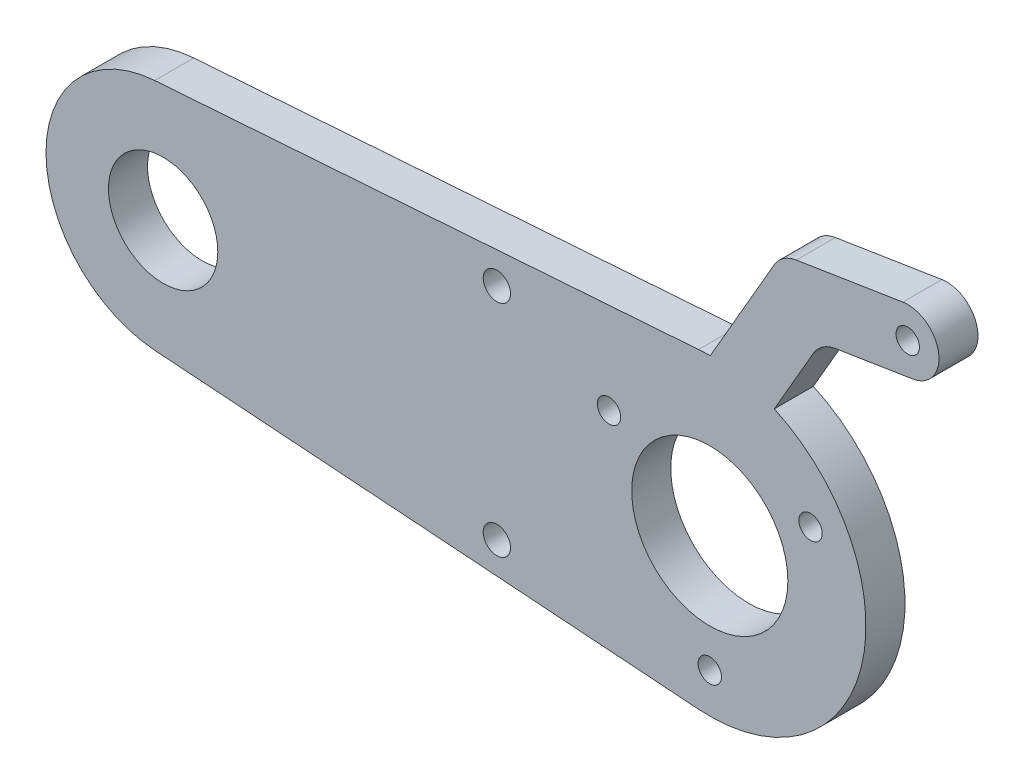
ISO-10303-21;
HEADER;
FILE_DESCRIPTION(('STEP AP214'),'2;1');
FILE_NAME('part.step','',(''),(''),'','','');
FILE_SCHEMA(('AUTOMOTIVE_DESIGN { 1 0 10303 214 1 1 1 1 }'));
ENDSEC;
DATA;
#1=APPLICATION_CONTEXT('core data for automotive mechanical design processes');
#2=APPLICATION_PROTOCOL_DEFINITION('international standard','automotive_design',2000,#1);
#3=PRODUCT_CONTEXT('',#1,'mechanical');
#4=PRODUCT('Part','Part','',(#3));
#5=PRODUCT_RELATED_PRODUCT_CATEGORY('part','',(#4));
#6=PRODUCT_DEFINITION_FORMATION('','',#4);
#7=PRODUCT_DEFINITION_CONTEXT('part definition',#1,'design');
#8=PRODUCT_DEFINITION('design','',#6,#7);
#9=PRODUCT_DEFINITION_SHAPE('','',#8);
#10=(LENGTH_UNIT() NAMED_UNIT(*) SI_UNIT(.MILLI.,.METRE.));
#11=(NAMED_UNIT(*) PLANE_ANGLE_UNIT() SI_UNIT($,.RADIAN.));
#12=(NAMED_UNIT(*) SI_UNIT($,.STERADIAN.) SOLID_ANGLE_UNIT());
#13=UNCERTAINTY_MEASURE_WITH_UNIT(LENGTH_MEASURE(1.E-05),#10,'distance_accuracy_value','');
#14=(GEOMETRIC_REPRESENTATION_CONTEXT(3) GLOBAL_UNCERTAINTY_ASSIGNED_CONTEXT((#13)) GLOBAL_UNIT_ASSIGNED_CONTEXT((#10,
#11,#12)) REPRESENTATION_CONTEXT('',''));
#15=CARTESIAN_POINT('',(0.,0.,0.));
#16=DIRECTION('',(0.,0.,1.));
#17=DIRECTION('',(1.,0.,0.));
#18=AXIS2_PLACEMENT_3D('',#15,#16,#17);
#19=CARTESIAN_POINT('',(0.,0.,5.));
#20=DIRECTION('',(0.,0.,-1.));
#21=DIRECTION('',(-1.,0.,0.));
#22=AXIS2_PLACEMENT_3D('',#19,#20,#21);
#23=PLANE('',#22);
#24=CARTESIAN_POINT('',(0.,0.,5.));
#25=DIRECTION('',(0.,0.,1.));
#26=DIRECTION('',(-1.,0.,0.));
#27=AXIS2_PLACEMENT_3D('',#24,#25,#26);
#28=CIRCLE('',#27,20.);
#29=CARTESIAN_POINT('',(-1.42857142857143,-19.9489143482413,5.));
#30=VERTEX_POINT('',#29);
#31=CARTESIAN_POINT('',(8.26328421639514,18.2131308115622,5.));
#32=VERTEX_POINT('',#31);
#33=EDGE_CURVE('E178',#30,#32,#28,.T.);
#34=ORIENTED_EDGE('',*,*,#33,.T.);
#35=DIRECTION('',(0.499999999999994,0.866025403784442,0.));
#36=VECTOR('',#35,1.);
#37=CARTESIAN_POINT('',(13.2632842163951,26.8733848494066,5.));
#38=LINE('',#37,#36);
#39=CARTESIAN_POINT('',(13.2632842163951,26.8733848494066,5.));
#40=VERTEX_POINT('',#39);
#41=EDGE_CURVE('E106',#32,#40,#38,.T.);
#42=ORIENTED_EDGE('',*,*,#41,.T.);
#43=CARTESIAN_POINT('',(16.7273858315328,24.8733848494066,5.));
#44=DIRECTION('',(0.,0.,-1.));
#45=DIRECTION('',(1.,0.,0.));
#46=AXIS2_PLACEMENT_3D('',#43,#44,#45);
#47=CIRCLE('',#46,4.);
#48=CARTESIAN_POINT('',(16.1016479713719,28.8241382117871,5.));
#49=VERTEX_POINT('',#48);
#50=EDGE_CURVE('E205',#40,#49,#47,.T.);
#51=ORIENTED_EDGE('',*,*,#50,.T.);
#52=DIRECTION('',(0.987688340595136,0.156434465040243,0.));
#53=VECTOR('',#52,1.);
#54=CARTESIAN_POINT('',(25.9785313773232,30.3884828621896,5.));
#55=LINE('',#54,#53);
#56=CARTESIAN_POINT('',(25.9785313773232,30.3884828621896,5.));
#57=VERTEX_POINT('',#56);
#58=EDGE_CURVE('E224',#49,#57,#55,.T.);
#59=ORIENTED_EDGE('',*,*,#58,.T.);
#60=CARTESIAN_POINT('',(25.3527935171623,34.3392362245701,5.));
#61=DIRECTION('',(0.,0.,1.));
#62=DIRECTION('',(1.,0.,0.));
#63=AXIS2_PLACEMENT_3D('',#60,#61,#62);
#64=CIRCLE('',#63,4.);
#65=CARTESIAN_POINT('',(24.7270556570013,38.2899895869507,5.));
#66=VERTEX_POINT('',#65);
#67=EDGE_CURVE('E221',#57,#66,#64,.T.);
#68=ORIENTED_EDGE('',*,*,#67,.T.);
#69=DIRECTION('',(-0.987688340595136,-0.156434465040243,0.));
#70=VECTOR('',#69,1.);
#71=CARTESIAN_POINT('',(11.0813468718889,36.1287216381888,5.));
#72=LINE('',#71,#70);
#73=CARTESIAN_POINT('',(11.0813468718889,36.1287216381888,5.));
#74=VERTEX_POINT('',#73);
#75=EDGE_CURVE('E223',#66,#74,#72,.T.);
#76=ORIENTED_EDGE('',*,*,#75,.T.);
#77=CARTESIAN_POINT('',(11.7070847320499,32.1779682758083,5.));
#78=DIRECTION('',(0.,0.,1.));
#79=DIRECTION('',(-1.,0.,0.));
#80=AXIS2_PLACEMENT_3D('',#77,#78,#79);
#81=CIRCLE('',#80,3.99999999999999);
#82=CARTESIAN_POINT('',(8.24298311691214,34.1779682758083,5.));
#83=VERTEX_POINT('',#82);
#84=EDGE_CURVE('E226',#74,#83,#81,.T.);
#85=ORIENTED_EDGE('',*,*,#84,.T.);
#86=DIRECTION('',(-0.499999999999994,-0.866025403784442,0.));
#87=VECTOR('',#86,1.);
#88=CARTESIAN_POINT('',(8.24298311691214,34.1779682758083,5.));
#89=LINE('',#88,#87);
#90=CARTESIAN_POINT('',(0.0572819558484016,19.9999179692701,5.));
#91=VERTEX_POINT('',#90);
#92=EDGE_CURVE('E232',#83,#91,#89,.T.);
#93=ORIENTED_EDGE('',*,*,#92,.T.);
#94=CARTESIAN_POINT('',(0.,0.,5.));
#95=DIRECTION('',(0.,0.,1.));
#96=DIRECTION('',(1.,0.,0.));
#97=AXIS2_PLACEMENT_3D('',#94,#95,#96);
#98=CIRCLE('',#97,20.);
#99=CARTESIAN_POINT('',(-1.42857142857143,19.9489143482413,5.));
#100=VERTEX_POINT('',#99);
#101=EDGE_CURVE('E137',#91,#100,#98,.T.);
#102=ORIENTED_EDGE('',*,*,#101,.T.);
#103=DIRECTION('',(-0.997445717412067,-0.0714285714285714,0.));
#104=VECTOR('',#103,1.);
#105=CARTESIAN_POINT('',(-71.0714285714286,14.961685761181,5.));
#106=LINE('',#105,#104);
#107=CARTESIAN_POINT('',(-71.0714285714286,14.961685761181,5.));
#108=VERTEX_POINT('',#107);
#109=EDGE_CURVE('E131',#100,#108,#106,.T.);
#110=ORIENTED_EDGE('',*,*,#109,.T.);
#111=CARTESIAN_POINT('',(-70.,0.,5.));
#112=DIRECTION('',(0.,0.,1.));
#113=DIRECTION('',(-1.,0.,0.));
#114=AXIS2_PLACEMENT_3D('',#111,#112,#113);
#115=CIRCLE('',#114,15.);
#116=CARTESIAN_POINT('',(-71.0714285714286,-14.961685761181,5.));
#117=VERTEX_POINT('',#116);
#118=EDGE_CURVE('E135',#108,#117,#115,.T.);
#119=ORIENTED_EDGE('',*,*,#118,.T.);
#120=DIRECTION('',(0.997445717412067,-0.0714285714285714,0.));
#121=VECTOR('',#120,1.);
#122=CARTESIAN_POINT('',(-71.0714285714286,-14.961685761181,5.));
#123=LINE('',#122,#121);
#124=EDGE_CURVE('E51',#117,#30,#123,.T.);
#125=ORIENTED_EDGE('',*,*,#124,.T.);
#126=EDGE_LOOP('',(#34,#42,#51,#59,#68,#76,#85,#93,#102,#110,#119,#125));
#127=FACE_BOUND('',#126,.T.);
#128=CARTESIAN_POINT('',(0.,0.,5.));
#129=DIRECTION('',(0.,0.,1.));
#130=DIRECTION('',(1.,0.,0.));
#131=AXIS2_PLACEMENT_3D('',#128,#129,#130);
#132=CIRCLE('',#131,10.);
#133=CARTESIAN_POINT('',(10.,0.,5.));
#134=VERTEX_POINT('',#133);
#135=EDGE_CURVE('E159',#134,#134,#132,.T.);
#136=ORIENTED_EDGE('',*,*,#135,.F.);
#137=EDGE_LOOP('',(#136));
#138=FACE_BOUND('',#137,.T.);
#139=CARTESIAN_POINT('',(-70.,0.,5.));
#140=DIRECTION('',(0.,0.,1.));
#141=DIRECTION('',(1.,0.,0.));
#142=AXIS2_PLACEMENT_3D('',#139,#140,#141);
#143=CIRCLE('',#142,7.);
#144=CARTESIAN_POINT('',(-63.,0.,5.));
#145=VERTEX_POINT('',#144);
#146=EDGE_CURVE('E336',#145,#145,#143,.T.);
#147=ORIENTED_EDGE('',*,*,#146,.F.);
#148=EDGE_LOOP('',(#147));
#149=FACE_BOUND('',#148,.T.);
#150=CARTESIAN_POINT('',(-12.9037785163881,7.45,5.));
#151=DIRECTION('',(0.,0.,1.));
#152=DIRECTION('',(1.,0.,0.));
#153=AXIS2_PLACEMENT_3D('',#150,#151,#152);
#154=CIRCLE('',#153,1.5);
#155=CARTESIAN_POINT('',(-11.4037785163881,7.45,5.));
#156=VERTEX_POINT('',#155);
#157=EDGE_CURVE('E330',#156,#156,#154,.T.);
#158=ORIENTED_EDGE('',*,*,#157,.F.);
#159=EDGE_LOOP('',(#158));
#160=FACE_BOUND('',#159,.T.);
#161=CARTESIAN_POINT('',(0.,-14.9000000000001,5.));
#162=DIRECTION('',(0.,0.,1.));
#163=DIRECTION('',(1.,0.,0.));
#164=AXIS2_PLACEMENT_3D('',#161,#162,#163);
#165=CIRCLE('',#164,1.5);
#166=CARTESIAN_POINT('',(1.5,-14.9000000000001,5.));
#167=VERTEX_POINT('',#166);
#168=EDGE_CURVE('E324',#167,#167,#165,.T.);
#169=ORIENTED_EDGE('',*,*,#168,.F.);
#170=EDGE_LOOP('',(#169));
#171=FACE_BOUND('',#170,.T.);
#172=CARTESIAN_POINT('',(12.9037785163882,7.44999999999981,5.));
#173=DIRECTION('',(0.,0.,1.));
#174=DIRECTION('',(1.,0.,0.));
#175=AXIS2_PLACEMENT_3D('',#172,#173,#174);
#176=CIRCLE('',#175,1.5);
#177=CARTESIAN_POINT('',(14.4037785163882,7.44999999999981,5.));
#178=VERTEX_POINT('',#177);
#179=EDGE_CURVE('E318',#178,#178,#176,.T.);
#180=ORIENTED_EDGE('',*,*,#179,.F.);
#181=EDGE_LOOP('',(#180));
#182=FACE_BOUND('',#181,.T.);
#183=CARTESIAN_POINT('',(-27.2623215608162,14.0886777814287,5.));
#184=DIRECTION('',(0.,0.,1.));
#185=DIRECTION('',(1.,0.,0.));
#186=AXIS2_PLACEMENT_3D('',#183,#184,#185);
#187=CIRCLE('',#186,1.75);
#188=CARTESIAN_POINT('',(-25.5123215608162,14.0886777814287,5.));
#189=VERTEX_POINT('',#188);
#190=EDGE_CURVE('E312',#189,#189,#187,.T.);
#191=ORIENTED_EDGE('',*,*,#190,.F.);
#192=EDGE_LOOP('',(#191));
#193=FACE_BOUND('',#192,.T.);
#194=CARTESIAN_POINT('',(-27.2623215608162,-14.0886777814287,5.));
#195=DIRECTION('',(0.,0.,1.));
#196=DIRECTION('',(1.,0.,0.));
#197=AXIS2_PLACEMENT_3D('',#194,#195,#196);
#198=CIRCLE('',#197,1.75);
#199=CARTESIAN_POINT('',(-25.5123215608162,-14.0886777814287,5.));
#200=VERTEX_POINT('',#199);
#201=EDGE_CURVE('E306',#200,#200,#198,.T.);
#202=ORIENTED_EDGE('',*,*,#201,.F.);
#203=EDGE_LOOP('',(#202));
#204=FACE_BOUND('',#203,.T.);
#205=CARTESIAN_POINT('',(25.3527935171623,34.3392362245701,5.));
#206=DIRECTION('',(0.,0.,1.));
#207=DIRECTION('',(1.,0.,0.));
#208=AXIS2_PLACEMENT_3D('',#205,#206,#207);
#209=CIRCLE('',#208,1.5);
#210=CARTESIAN_POINT('',(26.8527935171623,34.3392362245701,5.));
#211=VERTEX_POINT('',#210);
#212=EDGE_CURVE('E297',#211,#211,#209,.T.);
#213=ORIENTED_EDGE('',*,*,#212,.F.);
#214=EDGE_LOOP('',(#213));
#215=FACE_BOUND('',#214,.T.);
#216=ADVANCED_FACE('F34',(#127,#138,#149,#160,#171,#182,#193,#204,#215),#23,.F.);
#217=CARTESIAN_POINT('',(0.,0.,0.));
#218=DIRECTION('',(0.,0.,-1.));
#219=DIRECTION('',(-1.,0.,0.));
#220=AXIS2_PLACEMENT_3D('',#217,#218,#219);
#221=PLANE('',#220);
#222=CARTESIAN_POINT('',(-27.2623215608162,-14.0886777814287,0.));
#223=DIRECTION('',(0.,0.,1.));
#224=DIRECTION('',(1.,0.,0.));
#225=AXIS2_PLACEMENT_3D('',#222,#223,#224);
#226=CIRCLE('',#225,1.75);
#227=CARTESIAN_POINT('',(-25.5123215608162,-14.0886777814287,0.));
#228=VERTEX_POINT('',#227);
#229=EDGE_CURVE('E303',#228,#228,#226,.T.);
#230=ORIENTED_EDGE('',*,*,#229,.T.);
#231=EDGE_LOOP('',(#230));
#232=FACE_BOUND('',#231,.T.);
#233=CARTESIAN_POINT('',(12.9037785163882,7.44999999999981,0.));
#234=DIRECTION('',(0.,0.,1.));
#235=DIRECTION('',(1.,0.,0.));
#236=AXIS2_PLACEMENT_3D('',#233,#234,#235);
#237=CIRCLE('',#236,1.5);
#238=CARTESIAN_POINT('',(14.4037785163882,7.44999999999981,0.));
#239=VERTEX_POINT('',#238);
#240=EDGE_CURVE('E315',#239,#239,#237,.T.);
#241=ORIENTED_EDGE('',*,*,#240,.T.);
#242=EDGE_LOOP('',(#241));
#243=FACE_BOUND('',#242,.T.);
#244=CARTESIAN_POINT('',(-12.9037785163881,7.45,0.));
#245=DIRECTION('',(0.,0.,1.));
#246=DIRECTION('',(1.,0.,0.));
#247=AXIS2_PLACEMENT_3D('',#244,#245,#246);
#248=CIRCLE('',#247,1.5);
#249=CARTESIAN_POINT('',(-11.4037785163881,7.45,0.));
#250=VERTEX_POINT('',#249);
#251=EDGE_CURVE('E327',#250,#250,#248,.T.);
#252=ORIENTED_EDGE('',*,*,#251,.T.);
#253=EDGE_LOOP('',(#252));
#254=FACE_BOUND('',#253,.T.);
#255=CARTESIAN_POINT('',(0.,0.,0.));
#256=DIRECTION('',(0.,0.,1.));
#257=DIRECTION('',(1.,0.,0.));
#258=AXIS2_PLACEMENT_3D('',#255,#256,#257);
#259=CIRCLE('',#258,10.);
#260=CARTESIAN_POINT('',(10.,0.,0.));
#261=VERTEX_POINT('',#260);
#262=EDGE_CURVE('E339',#261,#261,#259,.T.);
#263=ORIENTED_EDGE('',*,*,#262,.T.);
#264=EDGE_LOOP('',(#263));
#265=FACE_BOUND('',#264,.T.);
#266=CARTESIAN_POINT('',(0.,0.,0.));
#267=DIRECTION('',(0.,0.,1.));
#268=DIRECTION('',(-1.,0.,0.));
#269=AXIS2_PLACEMENT_3D('',#266,#267,#268);
#270=CIRCLE('',#269,20.);
#271=CARTESIAN_POINT('',(-1.42857142857143,-19.9489143482413,0.));
#272=VERTEX_POINT('',#271);
#273=CARTESIAN_POINT('',(8.26328421639514,18.2131308115622,0.));
#274=VERTEX_POINT('',#273);
#275=EDGE_CURVE('E155',#272,#274,#270,.T.);
#276=ORIENTED_EDGE('',*,*,#275,.F.);
#277=DIRECTION('',(0.997445717412067,-0.0714285714285714,0.));
#278=VECTOR('',#277,1.);
#279=CARTESIAN_POINT('',(-71.0714285714286,-14.961685761181,0.));
#280=LINE('',#279,#278);
#281=CARTESIAN_POINT('',(-71.0714285714286,-14.961685761181,0.));
#282=VERTEX_POINT('',#281);
#283=EDGE_CURVE('E98',#282,#272,#280,.T.);
#284=ORIENTED_EDGE('',*,*,#283,.F.);
#285=CARTESIAN_POINT('',(-70.,0.,0.));
#286=DIRECTION('',(0.,0.,1.));
#287=DIRECTION('',(-1.,0.,0.));
#288=AXIS2_PLACEMENT_3D('',#285,#286,#287);
#289=CIRCLE('',#288,15.);
#290=CARTESIAN_POINT('',(-71.0714285714286,14.961685761181,0.));
#291=VERTEX_POINT('',#290);
#292=EDGE_CURVE('E92',#291,#282,#289,.T.);
#293=ORIENTED_EDGE('',*,*,#292,.F.);
#294=DIRECTION('',(-0.997445717412067,-0.0714285714285714,0.));
#295=VECTOR('',#294,1.);
#296=CARTESIAN_POINT('',(-71.0714285714286,14.961685761181,0.));
#297=LINE('',#296,#295);
#298=CARTESIAN_POINT('',(-1.42857142857143,19.9489143482413,0.));
#299=VERTEX_POINT('',#298);
#300=EDGE_CURVE('E145',#299,#291,#297,.T.);
#301=ORIENTED_EDGE('',*,*,#300,.F.);
#302=CARTESIAN_POINT('',(0.,0.,0.));
#303=DIRECTION('',(0.,0.,1.));
#304=DIRECTION('',(1.,0.,0.));
#305=AXIS2_PLACEMENT_3D('',#302,#303,#304);
#306=CIRCLE('',#305,20.);
#307=CARTESIAN_POINT('',(0.0572819558484016,19.9999179692701,0.));
#308=VERTEX_POINT('',#307);
#309=EDGE_CURVE('E173',#308,#299,#306,.T.);
#310=ORIENTED_EDGE('',*,*,#309,.F.);
#311=DIRECTION('',(-0.499999999999994,-0.866025403784442,0.));
#312=VECTOR('',#311,1.);
#313=CARTESIAN_POINT('',(8.24298311691214,34.1779682758083,0.));
#314=LINE('',#313,#312);
#315=CARTESIAN_POINT('',(8.24298311691214,34.1779682758083,0.));
#316=VERTEX_POINT('',#315);
#317=EDGE_CURVE('E171',#316,#308,#314,.T.);
#318=ORIENTED_EDGE('',*,*,#317,.F.);
#319=CARTESIAN_POINT('',(11.7070847320499,32.1779682758083,0.));
#320=DIRECTION('',(0.,0.,1.));
#321=DIRECTION('',(-1.,0.,0.));
#322=AXIS2_PLACEMENT_3D('',#319,#320,#321);
#323=CIRCLE('',#322,3.99999999999999);
#324=CARTESIAN_POINT('',(11.0813468718889,36.1287216381888,0.));
#325=VERTEX_POINT('',#324);
#326=EDGE_CURVE('E169',#325,#316,#323,.T.);
#327=ORIENTED_EDGE('',*,*,#326,.F.);
#328=DIRECTION('',(-0.987688340595136,-0.156434465040243,0.));
#329=VECTOR('',#328,1.);
#330=CARTESIAN_POINT('',(11.0813468718889,36.1287216381888,0.));
#331=LINE('',#330,#329);
#332=CARTESIAN_POINT('',(24.7270556570013,38.2899895869507,0.));
#333=VERTEX_POINT('',#332);
#334=EDGE_CURVE('E167',#333,#325,#331,.T.);
#335=ORIENTED_EDGE('',*,*,#334,.F.);
#336=CARTESIAN_POINT('',(25.3527935171623,34.3392362245701,0.));
#337=DIRECTION('',(0.,0.,1.));
#338=DIRECTION('',(1.,0.,0.));
#339=AXIS2_PLACEMENT_3D('',#336,#337,#338);
#340=CIRCLE('',#339,4.);
#341=CARTESIAN_POINT('',(25.9785313773232,30.3884828621896,0.));
#342=VERTEX_POINT('',#341);
#343=EDGE_CURVE('E165',#342,#333,#340,.T.);
#344=ORIENTED_EDGE('',*,*,#343,.F.);
#345=DIRECTION('',(0.987688340595136,0.156434465040243,0.));
#346=VECTOR('',#345,1.);
#347=CARTESIAN_POINT('',(25.9785313773232,30.3884828621896,0.));
#348=LINE('',#347,#346);
#349=CARTESIAN_POINT('',(16.1016479713719,28.8241382117871,0.));
#350=VERTEX_POINT('',#349);
#351=EDGE_CURVE('E163',#350,#342,#348,.T.);
#352=ORIENTED_EDGE('',*,*,#351,.F.);
#353=CARTESIAN_POINT('',(16.7273858315328,24.8733848494066,0.));
#354=DIRECTION('',(0.,0.,-1.));
#355=DIRECTION('',(1.,0.,0.));
#356=AXIS2_PLACEMENT_3D('',#353,#354,#355);
#357=CIRCLE('',#356,4.);
#358=CARTESIAN_POINT('',(13.2632842163951,26.8733848494066,0.));
#359=VERTEX_POINT('',#358);
#360=EDGE_CURVE('E161',#359,#350,#357,.T.);
#361=ORIENTED_EDGE('',*,*,#360,.F.);
#362=DIRECTION('',(0.499999999999994,0.866025403784442,0.));
#363=VECTOR('',#362,1.);
#364=CARTESIAN_POINT('',(13.2632842163951,26.8733848494066,0.));
#365=LINE('',#364,#363);
#366=EDGE_CURVE('E158',#274,#359,#365,.T.);
#367=ORIENTED_EDGE('',*,*,#366,.F.);
#368=EDGE_LOOP('',(#276,#284,#293,#301,#310,#318,#327,#335,#344,#352,#361,#367));
#369=FACE_BOUND('',#368,.T.);
#370=CARTESIAN_POINT('',(-70.,0.,0.));
#371=DIRECTION('',(0.,0.,1.));
#372=DIRECTION('',(1.,0.,0.));
#373=AXIS2_PLACEMENT_3D('',#370,#371,#372);
#374=CIRCLE('',#373,7.);
#375=CARTESIAN_POINT('',(-63.,0.,0.));
#376=VERTEX_POINT('',#375);
#377=EDGE_CURVE('E333',#376,#376,#374,.T.);
#378=ORIENTED_EDGE('',*,*,#377,.T.);
#379=EDGE_LOOP('',(#378));
#380=FACE_BOUND('',#379,.T.);
#381=CARTESIAN_POINT('',(0.,-14.9000000000001,0.));
#382=DIRECTION('',(0.,0.,1.));
#383=DIRECTION('',(1.,0.,0.));
#384=AXIS2_PLACEMENT_3D('',#381,#382,#383);
#385=CIRCLE('',#384,1.5);
#386=CARTESIAN_POINT('',(1.5,-14.9000000000001,0.));
#387=VERTEX_POINT('',#386);
#388=EDGE_CURVE('E321',#387,#387,#385,.T.);
#389=ORIENTED_EDGE('',*,*,#388,.T.);
#390=EDGE_LOOP('',(#389));
#391=FACE_BOUND('',#390,.T.);
#392=CARTESIAN_POINT('',(-27.2623215608162,14.0886777814287,0.));
#393=DIRECTION('',(0.,0.,1.));
#394=DIRECTION('',(1.,0.,0.));
#395=AXIS2_PLACEMENT_3D('',#392,#393,#394);
#396=CIRCLE('',#395,1.75);
#397=CARTESIAN_POINT('',(-25.5123215608162,14.0886777814287,0.));
#398=VERTEX_POINT('',#397);
#399=EDGE_CURVE('E309',#398,#398,#396,.T.);
#400=ORIENTED_EDGE('',*,*,#399,.T.);
#401=EDGE_LOOP('',(#400));
#402=FACE_BOUND('',#401,.T.);
#403=CARTESIAN_POINT('',(25.3527935171623,34.3392362245701,0.));
#404=DIRECTION('',(0.,0.,1.));
#405=DIRECTION('',(1.,0.,0.));
#406=AXIS2_PLACEMENT_3D('',#403,#404,#405);
#407=CIRCLE('',#406,1.5);
#408=CARTESIAN_POINT('',(26.8527935171623,34.3392362245701,0.));
#409=VERTEX_POINT('',#408);
#410=EDGE_CURVE('E300',#409,#409,#407,.T.);
#411=ORIENTED_EDGE('',*,*,#410,.T.);
#412=EDGE_LOOP('',(#411));
#413=FACE_BOUND('',#412,.T.);
#414=ADVANCED_FACE('F209',(#232,#243,#254,#265,#369,#380,#391,#402,#413),#221,.T.);
#415=CARTESIAN_POINT('',(0.,0.,5.));
#416=DIRECTION('',(0.,0.,-1.));
#417=DIRECTION('',(-1.,0.,0.));
#418=AXIS2_PLACEMENT_3D('',#415,#416,#417);
#419=CYLINDRICAL_SURFACE('',#418,20.);
#420=ORIENTED_EDGE('',*,*,#275,.T.);
#421=DIRECTION('',(0.,0.,-1.));
#422=VECTOR('',#421,1.);
#423=CARTESIAN_POINT('',(8.26328421639514,18.2131308115622,5.));
#424=LINE('',#423,#422);
#425=EDGE_CURVE('E11',#32,#274,#424,.T.);
#426=ORIENTED_EDGE('',*,*,#425,.F.);
#427=ORIENTED_EDGE('',*,*,#33,.F.);
#428=DIRECTION('',(0.,0.,-1.));
#429=VECTOR('',#428,1.);
#430=CARTESIAN_POINT('',(-1.42857142857143,-19.9489143482413,5.));
#431=LINE('',#430,#429);
#432=EDGE_CURVE('E151',#30,#272,#431,.T.);
#433=ORIENTED_EDGE('',*,*,#432,.T.);
#434=EDGE_LOOP('',(#420,#426,#427,#433));
#435=FACE_BOUND('',#434,.T.);
#436=ADVANCED_FACE('F36',(#435),#419,.T.);
#437=CARTESIAN_POINT('',(13.2632842163951,26.8733848494066,5.));
#438=DIRECTION('',(-0.866025403784442,0.499999999999994,0.));
#439=DIRECTION('',(-0.499999999999994,-0.866025403784442,0.));
#440=AXIS2_PLACEMENT_3D('',#437,#438,#439);
#441=PLANE('',#440);
#442=ORIENTED_EDGE('',*,*,#366,.T.);
#443=DIRECTION('',(0.,0.,-1.));
#444=VECTOR('',#443,1.);
#445=CARTESIAN_POINT('',(13.2632842163951,26.8733848494066,5.));
#446=LINE('',#445,#444);
#447=EDGE_CURVE('E43',#40,#359,#446,.T.);
#448=ORIENTED_EDGE('',*,*,#447,.F.);
#449=ORIENTED_EDGE('',*,*,#41,.F.);
#450=ORIENTED_EDGE('',*,*,#425,.T.);
#451=EDGE_LOOP('',(#442,#448,#449,#450));
#452=FACE_BOUND('',#451,.T.);
#453=ADVANCED_FACE('F487',(#452),#441,.F.);
#454=CARTESIAN_POINT('',(16.7273858315328,24.8733848494066,5.));
#455=DIRECTION('',(0.,0.,-1.));
#456=DIRECTION('',(-1.,0.,0.));
#457=AXIS2_PLACEMENT_3D('',#454,#455,#456);
#458=CYLINDRICAL_SURFACE('',#457,4.);
#459=ORIENTED_EDGE('',*,*,#360,.T.);
#460=DIRECTION('',(0.,0.,-1.));
#461=VECTOR('',#460,1.);
#462=CARTESIAN_POINT('',(16.1016479713719,28.8241382117871,5.));
#463=LINE('',#462,#461);
#464=EDGE_CURVE('E197',#49,#350,#463,.T.);
#465=ORIENTED_EDGE('',*,*,#464,.F.);
#466=ORIENTED_EDGE('',*,*,#50,.F.);
#467=ORIENTED_EDGE('',*,*,#447,.T.);
#468=EDGE_LOOP('',(#459,#465,#466,#467));
#469=FACE_BOUND('',#468,.T.);
#470=ADVANCED_FACE('F203',(#469),#458,.F.);
#471=CARTESIAN_POINT('',(25.9785313773232,30.3884828621896,5.));
#472=DIRECTION('',(-0.156434465040243,0.987688340595136,0.));
#473=DIRECTION('',(-0.987688340595136,-0.156434465040243,0.));
#474=AXIS2_PLACEMENT_3D('',#471,#472,#473);
#475=PLANE('',#474);
#476=ORIENTED_EDGE('',*,*,#351,.T.);
#477=DIRECTION('',(0.,0.,-1.));
#478=VECTOR('',#477,1.);
#479=CARTESIAN_POINT('',(25.9785313773232,30.3884828621896,5.));
#480=LINE('',#479,#478);
#481=EDGE_CURVE('E194',#57,#342,#480,.T.);
#482=ORIENTED_EDGE('',*,*,#481,.F.);
#483=ORIENTED_EDGE('',*,*,#58,.F.);
#484=ORIENTED_EDGE('',*,*,#464,.T.);
#485=EDGE_LOOP('',(#476,#482,#483,#484));
#486=FACE_BOUND('',#485,.T.);
#487=ADVANCED_FACE('F215',(#486),#475,.F.);
#488=CARTESIAN_POINT('',(25.3527935171623,34.3392362245701,5.));
#489=DIRECTION('',(0.,0.,-1.));
#490=DIRECTION('',(-1.,0.,0.));
#491=AXIS2_PLACEMENT_3D('',#488,#489,#490);
#492=CYLINDRICAL_SURFACE('',#491,4.);
#493=ORIENTED_EDGE('',*,*,#343,.T.);
#494=DIRECTION('',(0.,0.,-1.));
#495=VECTOR('',#494,1.);
#496=CARTESIAN_POINT('',(24.7270556570013,38.2899895869507,5.));
#497=LINE('',#496,#495);
#498=EDGE_CURVE('E191',#66,#333,#497,.T.);
#499=ORIENTED_EDGE('',*,*,#498,.F.);
#500=ORIENTED_EDGE('',*,*,#67,.F.);
#501=ORIENTED_EDGE('',*,*,#481,.T.);
#502=EDGE_LOOP('',(#493,#499,#500,#501));
#503=FACE_BOUND('',#502,.T.);
#504=ADVANCED_FACE('F219',(#503),#492,.T.);
#505=CARTESIAN_POINT('',(11.0813468718889,36.1287216381888,5.));
#506=DIRECTION('',(0.156434465040243,-0.987688340595136,0.));
#507=DIRECTION('',(0.987688340595136,0.156434465040243,0.));
#508=AXIS2_PLACEMENT_3D('',#505,#506,#507);
#509=PLANE('',#508);
#510=ORIENTED_EDGE('',*,*,#334,.T.);
#511=DIRECTION('',(0.,0.,-1.));
#512=VECTOR('',#511,1.);
#513=CARTESIAN_POINT('',(11.0813468718889,36.1287216381888,5.));
#514=LINE('',#513,#512);
#515=EDGE_CURVE('E188',#74,#325,#514,.T.);
#516=ORIENTED_EDGE('',*,*,#515,.F.);
#517=ORIENTED_EDGE('',*,*,#75,.F.);
#518=ORIENTED_EDGE('',*,*,#498,.T.);
#519=EDGE_LOOP('',(#510,#516,#517,#518));
#520=FACE_BOUND('',#519,.T.);
#521=ADVANCED_FACE('F452',(#520),#509,.F.);
#522=CARTESIAN_POINT('',(11.7070847320499,32.1779682758083,5.));
#523=DIRECTION('',(0.,0.,-1.));
#524=DIRECTION('',(-1.,0.,0.));
#525=AXIS2_PLACEMENT_3D('',#522,#523,#524);
#526=CYLINDRICAL_SURFACE('',#525,3.99999999999999);
#527=ORIENTED_EDGE('',*,*,#326,.T.);
#528=DIRECTION('',(0.,0.,-1.));
#529=VECTOR('',#528,1.);
#530=CARTESIAN_POINT('',(8.24298311691214,34.1779682758083,5.));
#531=LINE('',#530,#529);
#532=EDGE_CURVE('E185',#83,#316,#531,.T.);
#533=ORIENTED_EDGE('',*,*,#532,.F.);
#534=ORIENTED_EDGE('',*,*,#84,.F.);
#535=ORIENTED_EDGE('',*,*,#515,.T.);
#536=EDGE_LOOP('',(#527,#533,#534,#535));
#537=FACE_BOUND('',#536,.T.);
#538=ADVANCED_FACE('F443',(#537),#526,.T.);
#539=CARTESIAN_POINT('',(8.24298311691214,34.1779682758083,5.));
#540=DIRECTION('',(0.866025403784442,-0.499999999999994,0.));
#541=DIRECTION('',(0.499999999999994,0.866025403784442,0.));
#542=AXIS2_PLACEMENT_3D('',#539,#540,#541);
#543=PLANE('',#542);
#544=ORIENTED_EDGE('',*,*,#317,.T.);
#545=DIRECTION('',(0.,0.,-1.));
#546=VECTOR('',#545,1.);
#547=CARTESIAN_POINT('',(0.0572819558484016,19.9999179692701,5.));
#548=LINE('',#547,#546);
#549=EDGE_CURVE('E182',#91,#308,#548,.T.);
#550=ORIENTED_EDGE('',*,*,#549,.F.);
#551=ORIENTED_EDGE('',*,*,#92,.F.);
#552=ORIENTED_EDGE('',*,*,#532,.T.);
#553=EDGE_LOOP('',(#544,#550,#551,#552));
#554=FACE_BOUND('',#553,.T.);
#555=ADVANCED_FACE('F238',(#554),#543,.F.);
#556=CARTESIAN_POINT('',(0.,0.,5.));
#557=DIRECTION('',(0.,0.,-1.));
#558=DIRECTION('',(-1.,0.,0.));
#559=AXIS2_PLACEMENT_3D('',#556,#557,#558);
#560=CYLINDRICAL_SURFACE('',#559,20.);
#561=ORIENTED_EDGE('',*,*,#309,.T.);
#562=DIRECTION('',(0.,0.,-1.));
#563=VECTOR('',#562,1.);
#564=CARTESIAN_POINT('',(-1.42857142857143,19.9489143482413,5.));
#565=LINE('',#564,#563);
#566=EDGE_CURVE('E146',#100,#299,#565,.T.);
#567=ORIENTED_EDGE('',*,*,#566,.F.);
#568=ORIENTED_EDGE('',*,*,#101,.F.);
#569=ORIENTED_EDGE('',*,*,#549,.T.);
#570=EDGE_LOOP('',(#561,#567,#568,#569));
#571=FACE_BOUND('',#570,.T.);
#572=ADVANCED_FACE('F242',(#571),#560,.T.);
#573=CARTESIAN_POINT('',(-71.0714285714286,14.961685761181,5.));
#574=DIRECTION('',(0.0714285714285714,-0.997445717412067,0.));
#575=DIRECTION('',(0.997445717412067,0.0714285714285714,0.));
#576=AXIS2_PLACEMENT_3D('',#573,#574,#575);
#577=PLANE('',#576);
#578=ORIENTED_EDGE('',*,*,#300,.T.);
#579=DIRECTION('',(0.,0.,-1.));
#580=VECTOR('',#579,1.);
#581=CARTESIAN_POINT('',(-71.0714285714286,14.961685761181,5.));
#582=LINE('',#581,#580);
#583=EDGE_CURVE('E142',#108,#291,#582,.T.);
#584=ORIENTED_EDGE('',*,*,#583,.F.);
#585=ORIENTED_EDGE('',*,*,#109,.F.);
#586=ORIENTED_EDGE('',*,*,#566,.T.);
#587=EDGE_LOOP('',(#578,#584,#585,#586));
#588=FACE_BOUND('',#587,.T.);
#589=ADVANCED_FACE('F143',(#588),#577,.F.);
#590=CARTESIAN_POINT('',(-70.,0.,5.));
#591=DIRECTION('',(0.,0.,-1.));
#592=DIRECTION('',(-1.,0.,0.));
#593=AXIS2_PLACEMENT_3D('',#590,#591,#592);
#594=CYLINDRICAL_SURFACE('',#593,15.);
#595=ORIENTED_EDGE('',*,*,#292,.T.);
#596=DIRECTION('',(0.,0.,-1.));
#597=VECTOR('',#596,1.);
#598=CARTESIAN_POINT('',(-71.0714285714286,-14.961685761181,5.));
#599=LINE('',#598,#597);
#600=EDGE_CURVE('E147',#117,#282,#599,.T.);
#601=ORIENTED_EDGE('',*,*,#600,.F.);
#602=ORIENTED_EDGE('',*,*,#118,.F.);
#603=ORIENTED_EDGE('',*,*,#583,.T.);
#604=EDGE_LOOP('',(#595,#601,#602,#603));
#605=FACE_BOUND('',#604,.T.);
#606=ADVANCED_FACE('F149',(#605),#594,.T.);
#607=CARTESIAN_POINT('',(-71.0714285714286,-14.961685761181,5.));
#608=DIRECTION('',(0.0714285714285714,0.997445717412067,0.));
#609=DIRECTION('',(-0.997445717412067,0.0714285714285714,0.));
#610=AXIS2_PLACEMENT_3D('',#607,#608,#609);
#611=PLANE('',#610);
#612=ORIENTED_EDGE('',*,*,#283,.T.);
#613=ORIENTED_EDGE('',*,*,#432,.F.);
#614=ORIENTED_EDGE('',*,*,#124,.F.);
#615=ORIENTED_EDGE('',*,*,#600,.T.);
#616=EDGE_LOOP('',(#612,#613,#614,#615));
#617=FACE_BOUND('',#616,.T.);
#618=ADVANCED_FACE('F246',(#617),#611,.F.);
#619=CARTESIAN_POINT('',(0.,0.,5.));
#620=DIRECTION('',(0.,0.,-1.));
#621=DIRECTION('',(-1.,0.,0.));
#622=AXIS2_PLACEMENT_3D('',#619,#620,#621);
#623=CYLINDRICAL_SURFACE('',#622,10.);
#624=ORIENTED_EDGE('',*,*,#135,.T.);
#625=EDGE_LOOP('',(#624));
#626=FACE_BOUND('',#625,.T.);
#627=ORIENTED_EDGE('',*,*,#262,.F.);
#628=EDGE_LOOP('',(#627));
#629=FACE_BOUND('',#628,.T.);
#630=ADVANCED_FACE('F248',(#626,#629),#623,.F.);
#631=CARTESIAN_POINT('',(-70.,0.,5.));
#632=DIRECTION('',(0.,0.,-1.));
#633=DIRECTION('',(-1.,0.,0.));
#634=AXIS2_PLACEMENT_3D('',#631,#632,#633);
#635=CYLINDRICAL_SURFACE('',#634,7.);
#636=ORIENTED_EDGE('',*,*,#146,.T.);
#637=EDGE_LOOP('',(#636));
#638=FACE_BOUND('',#637,.T.);
#639=ORIENTED_EDGE('',*,*,#377,.F.);
#640=EDGE_LOOP('',(#639));
#641=FACE_BOUND('',#640,.T.);
#642=ADVANCED_FACE('F254',(#638,#641),#635,.F.);
#643=CARTESIAN_POINT('',(-12.9037785163881,7.45,5.));
#644=DIRECTION('',(0.,0.,-1.));
#645=DIRECTION('',(-1.,0.,0.));
#646=AXIS2_PLACEMENT_3D('',#643,#644,#645);
#647=CYLINDRICAL_SURFACE('',#646,1.5);
#648=ORIENTED_EDGE('',*,*,#157,.T.);
#649=EDGE_LOOP('',(#648));
#650=FACE_BOUND('',#649,.T.);
#651=ORIENTED_EDGE('',*,*,#251,.F.);
#652=EDGE_LOOP('',(#651));
#653=FACE_BOUND('',#652,.T.);
#654=ADVANCED_FACE('F268',(#650,#653),#647,.F.);
#655=CARTESIAN_POINT('',(0.,-14.9000000000001,5.));
#656=DIRECTION('',(0.,0.,-1.));
#657=DIRECTION('',(-1.,0.,0.));
#658=AXIS2_PLACEMENT_3D('',#655,#656,#657);
#659=CYLINDRICAL_SURFACE('',#658,1.5);
#660=ORIENTED_EDGE('',*,*,#168,.T.);
#661=EDGE_LOOP('',(#660));
#662=FACE_BOUND('',#661,.T.);
#663=ORIENTED_EDGE('',*,*,#388,.F.);
#664=EDGE_LOOP('',(#663));
#665=FACE_BOUND('',#664,.T.);
#666=ADVANCED_FACE('F272',(#662,#665),#659,.F.);
#667=CARTESIAN_POINT('',(12.9037785163882,7.44999999999981,5.));
#668=DIRECTION('',(0.,0.,-1.));
#669=DIRECTION('',(-1.,0.,0.));
#670=AXIS2_PLACEMENT_3D('',#667,#668,#669);
#671=CYLINDRICAL_SURFACE('',#670,1.5);
#672=ORIENTED_EDGE('',*,*,#179,.T.);
#673=EDGE_LOOP('',(#672));
#674=FACE_BOUND('',#673,.T.);
#675=ORIENTED_EDGE('',*,*,#240,.F.);
#676=EDGE_LOOP('',(#675));
#677=FACE_BOUND('',#676,.T.);
#678=ADVANCED_FACE('F276',(#674,#677),#671,.F.);
#679=CARTESIAN_POINT('',(-27.2623215608162,14.0886777814287,5.));
#680=DIRECTION('',(0.,0.,-1.));
#681=DIRECTION('',(-1.,0.,0.));
#682=AXIS2_PLACEMENT_3D('',#679,#680,#681);
#683=CYLINDRICAL_SURFACE('',#682,1.75);
#684=ORIENTED_EDGE('',*,*,#190,.T.);
#685=EDGE_LOOP('',(#684));
#686=FACE_BOUND('',#685,.T.);
#687=ORIENTED_EDGE('',*,*,#399,.F.);
#688=EDGE_LOOP('',(#687));
#689=FACE_BOUND('',#688,.T.);
#690=ADVANCED_FACE('F280',(#686,#689),#683,.F.);
#691=CARTESIAN_POINT('',(-27.2623215608162,-14.0886777814287,5.));
#692=DIRECTION('',(0.,0.,-1.));
#693=DIRECTION('',(-1.,0.,0.));
#694=AXIS2_PLACEMENT_3D('',#691,#692,#693);
#695=CYLINDRICAL_SURFACE('',#694,1.75);
#696=ORIENTED_EDGE('',*,*,#201,.T.);
#697=EDGE_LOOP('',(#696));
#698=FACE_BOUND('',#697,.T.);
#699=ORIENTED_EDGE('',*,*,#229,.F.);
#700=EDGE_LOOP('',(#699));
#701=FACE_BOUND('',#700,.T.);
#702=ADVANCED_FACE('F284',(#698,#701),#695,.F.);
#703=CARTESIAN_POINT('',(25.3527935171623,34.3392362245701,5.));
#704=DIRECTION('',(0.,0.,-1.));
#705=DIRECTION('',(-1.,0.,0.));
#706=AXIS2_PLACEMENT_3D('',#703,#704,#705);
#707=CYLINDRICAL_SURFACE('',#706,1.5);
#708=ORIENTED_EDGE('',*,*,#212,.T.);
#709=EDGE_LOOP('',(#708));
#710=FACE_BOUND('',#709,.T.);
#711=ORIENTED_EDGE('',*,*,#410,.F.);
#712=EDGE_LOOP('',(#711));
#713=FACE_BOUND('',#712,.T.);
#714=ADVANCED_FACE('F288',(#710,#713),#707,.F.);
#715=CLOSED_SHELL('',(#216,#414,#436,#453,#470,#487,#504,#521,#538,#555,#572,#589,#606,#618,
#630,#642,#654,#666,#678,#690,#702,#714));
#716=MANIFOLD_SOLID_BREP('B2',#715);
#717=ADVANCED_BREP_SHAPE_REPRESENTATION('',(#18,#716),#14);
#718=SHAPE_DEFINITION_REPRESENTATION(#9,#717);
ENDSEC;
END-ISO-10303-21;
